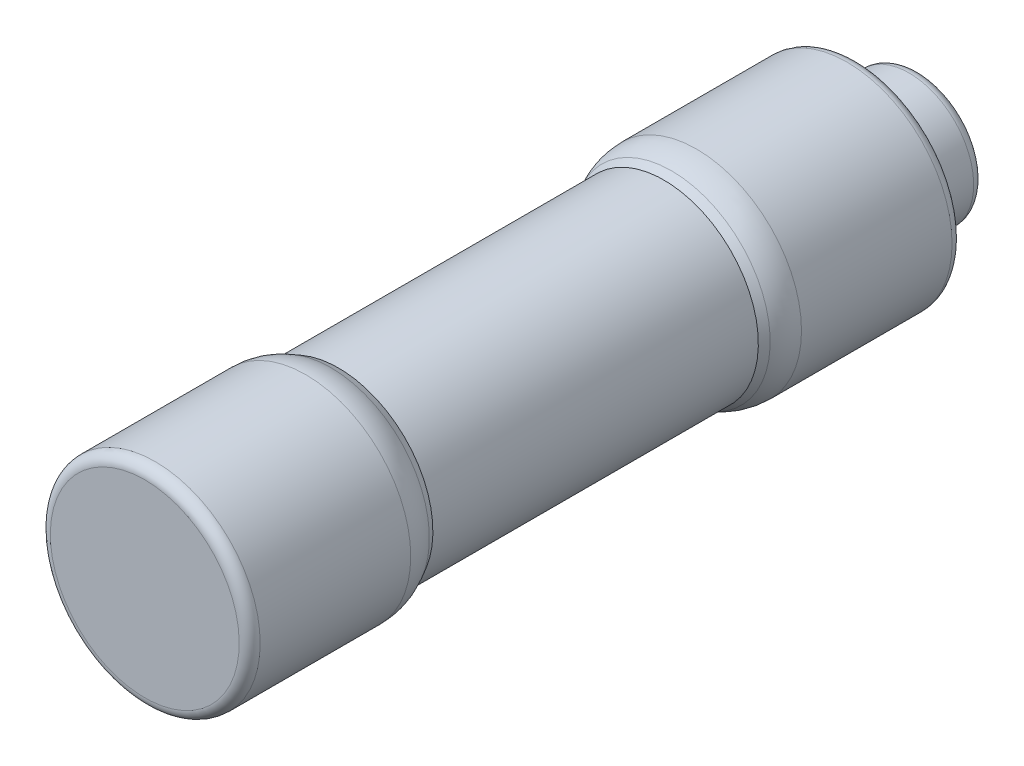
ISO-10303-21;
HEADER;
FILE_DESCRIPTION(('STEP AP214'),'2;1');
FILE_NAME('part.step','',(''),(''),'','','');
FILE_SCHEMA(('AUTOMOTIVE_DESIGN { 1 0 10303 214 1 1 1 1 }'));
ENDSEC;
DATA;
#1=APPLICATION_CONTEXT('core data for automotive mechanical design processes');
#2=APPLICATION_PROTOCOL_DEFINITION('international standard','automotive_design',2000,#1);
#3=PRODUCT_CONTEXT('',#1,'mechanical');
#4=PRODUCT('Part','Part','',(#3));
#5=PRODUCT_RELATED_PRODUCT_CATEGORY('part','',(#4));
#6=PRODUCT_DEFINITION_FORMATION('','',#4);
#7=PRODUCT_DEFINITION_CONTEXT('part definition',#1,'design');
#8=PRODUCT_DEFINITION('design','',#6,#7);
#9=PRODUCT_DEFINITION_SHAPE('','',#8);
#10=(LENGTH_UNIT() NAMED_UNIT(*) SI_UNIT(.MILLI.,.METRE.));
#11=(NAMED_UNIT(*) PLANE_ANGLE_UNIT() SI_UNIT($,.RADIAN.));
#12=(NAMED_UNIT(*) SI_UNIT($,.STERADIAN.) SOLID_ANGLE_UNIT());
#13=UNCERTAINTY_MEASURE_WITH_UNIT(LENGTH_MEASURE(1.E-05),#10,'distance_accuracy_value','');
#14=(GEOMETRIC_REPRESENTATION_CONTEXT(3) GLOBAL_UNCERTAINTY_ASSIGNED_CONTEXT((#13)) GLOBAL_UNIT_ASSIGNED_CONTEXT((#10,
#11,#12)) REPRESENTATION_CONTEXT('',''));
#15=CARTESIAN_POINT('',(0.,0.,0.));
#16=DIRECTION('',(0.,0.,1.));
#17=DIRECTION('',(1.,0.,0.));
#18=AXIS2_PLACEMENT_3D('',#15,#16,#17);
#19=CARTESIAN_POINT('',(-5.169375,-4.64343749999999,-6.477));
#20=DIRECTION('',(0.,0.,-1.));
#21=DIRECTION('',(0.,1.,0.));
#22=AXIS2_PLACEMENT_3D('',#19,#20,#21);
#23=PLANE('',#22);
#24=CARTESIAN_POINT('',(0.,0.,-6.477));
#25=DIRECTION('',(0.,0.,1.));
#26=DIRECTION('',(0.,-1.,0.));
#27=AXIS2_PLACEMENT_3D('',#24,#25,#26);
#28=CIRCLE('',#27,4.6434375);
#29=CARTESIAN_POINT('',(0.,-4.64343749999999,-6.477));
#30=VERTEX_POINT('',#29);
#31=EDGE_CURVE('E11',#30,#30,#28,.T.);
#32=ORIENTED_EDGE('',*,*,#31,.F.);
#33=EDGE_LOOP('',(#32));
#34=FACE_BOUND('',#33,.T.);
#35=ADVANCED_FACE('F39',(#34),#23,.T.);
#36=CARTESIAN_POINT('',(-5.169375,-4.64343749999999,9.525));
#37=DIRECTION('',(0.,0.,1.));
#38=DIRECTION('',(1.,0.,0.));
#39=AXIS2_PLACEMENT_3D('',#36,#37,#38);
#40=PLANE('',#39);
#41=CARTESIAN_POINT('',(0.,0.,9.525));
#42=DIRECTION('',(0.,0.,1.));
#43=DIRECTION('',(0.,-1.,0.));
#44=AXIS2_PLACEMENT_3D('',#41,#42,#43);
#45=CIRCLE('',#44,4.6434375);
#46=CARTESIAN_POINT('',(0.,-4.64343749999999,9.525));
#47=VERTEX_POINT('',#46);
#48=EDGE_CURVE('E45',#47,#47,#45,.T.);
#49=ORIENTED_EDGE('',*,*,#48,.T.);
#50=EDGE_LOOP('',(#49));
#51=FACE_BOUND('',#50,.T.);
#52=ADVANCED_FACE('F51',(#51),#40,.T.);
#53=CARTESIAN_POINT('',(0.,0.,19.05));
#54=DIRECTION('',(0.,0.,1.));
#55=DIRECTION('',(0.,-1.,0.));
#56=AXIS2_PLACEMENT_3D('',#53,#54,#55);
#57=CYLINDRICAL_SURFACE('',#56,4.6434375);
#58=ORIENTED_EDGE('',*,*,#48,.F.);
#59=EDGE_LOOP('',(#58));
#60=FACE_BOUND('',#59,.T.);
#61=ORIENTED_EDGE('',*,*,#31,.T.);
#62=EDGE_LOOP('',(#61));
#63=FACE_BOUND('',#62,.T.);
#64=ADVANCED_FACE('F53',(#60,#63),#57,.T.);
#65=CLOSED_SHELL('',(#35,#52,#64));
#66=MANIFOLD_SOLID_BREP('B2',#65);
#67=CARTESIAN_POINT('',(-5.169375,-4.64343749999999,-6.477));
#68=DIRECTION('',(0.,0.,-1.));
#69=DIRECTION('',(0.,1.,0.));
#70=AXIS2_PLACEMENT_3D('',#67,#68,#69);
#71=PLANE('',#70);
#72=CARTESIAN_POINT('',(0.,0.,-6.477));
#73=DIRECTION('',(0.,0.,1.));
#74=DIRECTION('',(0.,-1.,0.));
#75=AXIS2_PLACEMENT_3D('',#72,#73,#74);
#76=CIRCLE('',#75,4.6434375);
#77=CARTESIAN_POINT('',(0.,-4.64343749999999,-6.477));
#78=VERTEX_POINT('',#77);
#79=EDGE_CURVE('E90',#78,#78,#76,.T.);
#80=ORIENTED_EDGE('',*,*,#79,.T.);
#81=EDGE_LOOP('',(#80));
#82=FACE_BOUND('',#81,.T.);
#83=ADVANCED_FACE('F86',(#82),#71,.F.);
#84=CARTESIAN_POINT('',(0.,0.,-19.05));
#85=DIRECTION('',(0.,0.,1.));
#86=DIRECTION('',(0.,-1.,0.));
#87=AXIS2_PLACEMENT_3D('',#84,#85,#86);
#88=PLANE('',#87);
#89=CARTESIAN_POINT('',(0.,0.,-19.05));
#90=DIRECTION('',(0.,0.,1.));
#91=DIRECTION('',(0.,-1.,0.));
#92=AXIS2_PLACEMENT_3D('',#89,#90,#91);
#93=CIRCLE('',#92,2.65906249999999);
#94=CARTESIAN_POINT('',(0.,-2.65906249999999,-19.05));
#95=VERTEX_POINT('',#94);
#96=EDGE_CURVE('E106',#95,#95,#93,.F.);
#97=ORIENTED_EDGE('',*,*,#96,.T.);
#98=EDGE_LOOP('',(#97));
#99=FACE_BOUND('',#98,.T.);
#100=ADVANCED_FACE('F135',(#99),#88,.F.);
#101=CARTESIAN_POINT('',(0.,0.,19.05));
#102=DIRECTION('',(0.,0.,1.));
#103=DIRECTION('',(0.,-1.,0.));
#104=AXIS2_PLACEMENT_3D('',#101,#102,#103);
#105=CYLINDRICAL_SURFACE('',#104,3.17499999999999);
#106=CARTESIAN_POINT('',(0.,0.,-18.5340625));
#107=DIRECTION('',(0.,0.,1.));
#108=DIRECTION('',(0.,-1.,0.));
#109=AXIS2_PLACEMENT_3D('',#106,#107,#108);
#110=CIRCLE('',#109,3.17499999999999);
#111=CARTESIAN_POINT('',(0.,-3.17499999999999,-18.5340625));
#112=VERTEX_POINT('',#111);
#113=EDGE_CURVE('E103',#112,#112,#110,.T.);
#114=ORIENTED_EDGE('',*,*,#113,.T.);
#115=EDGE_LOOP('',(#114));
#116=FACE_BOUND('',#115,.T.);
#117=CARTESIAN_POINT('',(0.,0.,-16.5179375));
#118=DIRECTION('',(0.,0.,1.));
#119=DIRECTION('',(0.,-1.,0.));
#120=AXIS2_PLACEMENT_3D('',#117,#118,#119);
#121=CIRCLE('',#120,3.17499999999999);
#122=CARTESIAN_POINT('',(0.,-3.17499999999999,-16.5179375));
#123=VERTEX_POINT('',#122);
#124=EDGE_CURVE('E98',#123,#123,#121,.F.);
#125=ORIENTED_EDGE('',*,*,#124,.T.);
#126=EDGE_LOOP('',(#125));
#127=FACE_BOUND('',#126,.T.);
#128=ADVANCED_FACE('F141',(#116,#127),#105,.T.);
#129=CARTESIAN_POINT('',(0.,3.175,-16.002));
#130=DIRECTION('',(0.,0.,1.));
#131=DIRECTION('',(0.,-1.,0.));
#132=AXIS2_PLACEMENT_3D('',#129,#130,#131);
#133=PLANE('',#132);
#134=CARTESIAN_POINT('',(0.,0.,-16.002));
#135=DIRECTION('',(0.,0.,1.));
#136=DIRECTION('',(0.,-1.,0.));
#137=AXIS2_PLACEMENT_3D('',#134,#135,#136);
#138=CIRCLE('',#137,3.69093749999999);
#139=CARTESIAN_POINT('',(0.,-3.69093749999999,-16.002));
#140=VERTEX_POINT('',#139);
#141=EDGE_CURVE('E112',#140,#140,#138,.T.);
#142=ORIENTED_EDGE('',*,*,#141,.T.);
#143=EDGE_LOOP('',(#142));
#144=FACE_BOUND('',#143,.T.);
#145=CARTESIAN_POINT('',(0.,0.,-16.002));
#146=DIRECTION('',(0.,0.,1.));
#147=DIRECTION('',(0.,-1.,0.));
#148=AXIS2_PLACEMENT_3D('',#145,#146,#147);
#149=CIRCLE('',#148,4.6434375);
#150=CARTESIAN_POINT('',(0.,-4.64343749999999,-16.002));
#151=VERTEX_POINT('',#150);
#152=EDGE_CURVE('E109',#151,#151,#149,.F.);
#153=ORIENTED_EDGE('',*,*,#152,.T.);
#154=EDGE_LOOP('',(#153));
#155=FACE_BOUND('',#154,.T.);
#156=ADVANCED_FACE('F133',(#144,#155),#133,.F.);
#157=CARTESIAN_POINT('',(0.,0.,19.05));
#158=DIRECTION('',(0.,0.,1.));
#159=DIRECTION('',(0.,-1.,0.));
#160=AXIS2_PLACEMENT_3D('',#157,#158,#159);
#161=CYLINDRICAL_SURFACE('',#160,5.159375);
#162=CARTESIAN_POINT('',(0.,0.,-15.4860625));
#163=DIRECTION('',(0.,0.,1.));
#164=DIRECTION('',(0.,-1.,0.));
#165=AXIS2_PLACEMENT_3D('',#162,#163,#164);
#166=CIRCLE('',#165,5.159375);
#167=CARTESIAN_POINT('',(0.,-5.15937499999999,-15.4860625));
#168=VERTEX_POINT('',#167);
#169=EDGE_CURVE('E115',#168,#168,#166,.T.);
#170=ORIENTED_EDGE('',*,*,#169,.T.);
#171=EDGE_LOOP('',(#170));
#172=FACE_BOUND('',#171,.T.);
#173=CARTESIAN_POINT('',(0.,0.,-8.08328967538261));
#174=DIRECTION('',(0.,0.,-1.));
#175=DIRECTION('',(0.,1.,0.));
#176=AXIS2_PLACEMENT_3D('',#173,#174,#175);
#177=CIRCLE('',#176,5.159375);
#178=CARTESIAN_POINT('',(0.,5.159375,-8.08328967538261));
#179=VERTEX_POINT('',#178);
#180=EDGE_CURVE('E94',#179,#179,#177,.T.);
#181=ORIENTED_EDGE('',*,*,#180,.T.);
#182=EDGE_LOOP('',(#181));
#183=FACE_BOUND('',#182,.T.);
#184=ADVANCED_FACE('F125',(#172,#183),#161,.T.);
#185=CARTESIAN_POINT('',(0.,0.,-7.4295));
#186=DIRECTION('',(0.,0.,-1.));
#187=DIRECTION('',(0.,1.,0.));
#188=AXIS2_PLACEMENT_3D('',#185,#186,#187);
#189=CONICAL_SURFACE('',#188,5.159375,0.496422753404885);
#190=CARTESIAN_POINT('',(0.,0.,-6.85462799063139));
#191=DIRECTION('',(0.,0.,1.));
#192=DIRECTION('',(0.,-1.,0.));
#193=AXIS2_PLACEMENT_3D('',#190,#191,#192);
#194=CIRCLE('',#193,4.84798599492533);
#195=CARTESIAN_POINT('',(0.,-4.84798599492532,-6.85462799063139));
#196=VERTEX_POINT('',#195);
#197=EDGE_CURVE('E38',#196,#196,#194,.T.);
#198=ORIENTED_EDGE('',*,*,#197,.T.);
#199=EDGE_LOOP('',(#198));
#200=FACE_BOUND('',#199,.T.);
#201=ORIENTED_EDGE('',*,*,#79,.F.);
#202=EDGE_LOOP('',(#201));
#203=FACE_BOUND('',#202,.T.);
#204=ADVANCED_FACE('F88',(#200,#203),#189,.T.);
#205=CARTESIAN_POINT('',(0.,0.,-8.08328967538261));
#206=DIRECTION('',(0.,0.,-1.));
#207=DIRECTION('',(0.,1.,0.));
#208=AXIS2_PLACEMENT_3D('',#205,#206,#207);
#209=DEGENERATE_TOROIDAL_SURFACE('',#208,2.5796875,2.5796875,.T.);
#210=ORIENTED_EDGE('',*,*,#180,.F.);
#211=EDGE_LOOP('',(#210));
#212=FACE_BOUND('',#211,.T.);
#213=ORIENTED_EDGE('',*,*,#197,.F.);
#214=EDGE_LOOP('',(#213));
#215=FACE_BOUND('',#214,.T.);
#216=ADVANCED_FACE('F124',(#212,#215),#209,.T.);
#217=CARTESIAN_POINT('',(0.,0.,-18.5340625));
#218=DIRECTION('',(0.,0.,1.));
#219=DIRECTION('',(0.,-1.,0.));
#220=AXIS2_PLACEMENT_3D('',#217,#218,#219);
#221=TOROIDAL_SURFACE('',#220,2.65906249999999,0.5159375);
#222=ORIENTED_EDGE('',*,*,#96,.F.);
#223=EDGE_LOOP('',(#222));
#224=FACE_BOUND('',#223,.T.);
#225=ORIENTED_EDGE('',*,*,#113,.F.);
#226=EDGE_LOOP('',(#225));
#227=FACE_BOUND('',#226,.T.);
#228=ADVANCED_FACE('F130',(#224,#227),#221,.T.);
#229=CARTESIAN_POINT('',(0.,0.,-16.5179375));
#230=DIRECTION('',(0.,0.,1.));
#231=DIRECTION('',(0.,-1.,0.));
#232=AXIS2_PLACEMENT_3D('',#229,#230,#231);
#233=TOROIDAL_SURFACE('',#232,3.69093749999999,0.5159375);
#234=ORIENTED_EDGE('',*,*,#124,.F.);
#235=EDGE_LOOP('',(#234));
#236=FACE_BOUND('',#235,.T.);
#237=ORIENTED_EDGE('',*,*,#141,.F.);
#238=EDGE_LOOP('',(#237));
#239=FACE_BOUND('',#238,.T.);
#240=ADVANCED_FACE('F146',(#236,#239),#233,.F.);
#241=CARTESIAN_POINT('',(0.,0.,-15.4860625));
#242=DIRECTION('',(0.,0.,1.));
#243=DIRECTION('',(0.,-1.,0.));
#244=AXIS2_PLACEMENT_3D('',#241,#242,#243);
#245=TOROIDAL_SURFACE('',#244,4.6434375,0.5159375);
#246=ORIENTED_EDGE('',*,*,#152,.F.);
#247=EDGE_LOOP('',(#246));
#248=FACE_BOUND('',#247,.T.);
#249=ORIENTED_EDGE('',*,*,#169,.F.);
#250=EDGE_LOOP('',(#249));
#251=FACE_BOUND('',#250,.T.);
#252=ADVANCED_FACE('F137',(#248,#251),#245,.T.);
#253=CLOSED_SHELL('',(#83,#100,#128,#156,#184,#204,#216,#228,#240,#252));
#254=MANIFOLD_SOLID_BREP('B6',#253);
#255=CARTESIAN_POINT('',(-5.169375,-4.64343749999999,9.525));
#256=DIRECTION('',(0.,0.,1.));
#257=DIRECTION('',(1.,0.,0.));
#258=AXIS2_PLACEMENT_3D('',#255,#256,#257);
#259=PLANE('',#258);
#260=CARTESIAN_POINT('',(0.,0.,9.525));
#261=DIRECTION('',(0.,0.,1.));
#262=DIRECTION('',(0.,-1.,0.));
#263=AXIS2_PLACEMENT_3D('',#260,#261,#262);
#264=CIRCLE('',#263,4.6434375);
#265=CARTESIAN_POINT('',(0.,-4.64343749999999,9.525));
#266=VERTEX_POINT('',#265);
#267=EDGE_CURVE('E250',#266,#266,#264,.T.);
#268=ORIENTED_EDGE('',*,*,#267,.F.);
#269=EDGE_LOOP('',(#268));
#270=FACE_BOUND('',#269,.T.);
#271=ADVANCED_FACE('F231',(#270),#259,.F.);
#272=CARTESIAN_POINT('',(0.,5.159375,19.05));
#273=DIRECTION('',(0.,0.,-1.));
#274=DIRECTION('',(0.,1.,0.));
#275=AXIS2_PLACEMENT_3D('',#272,#273,#274);
#276=PLANE('',#275);
#277=CARTESIAN_POINT('',(0.,0.,19.05));
#278=DIRECTION('',(0.,0.,-1.));
#279=DIRECTION('',(0.,1.,0.));
#280=AXIS2_PLACEMENT_3D('',#277,#278,#279);
#281=CIRCLE('',#280,4.6434375);
#282=CARTESIAN_POINT('',(0.,4.6434375,19.05));
#283=VERTEX_POINT('',#282);
#284=EDGE_CURVE('E237',#283,#283,#281,.F.);
#285=ORIENTED_EDGE('',*,*,#284,.T.);
#286=EDGE_LOOP('',(#285));
#287=FACE_BOUND('',#286,.T.);
#288=ADVANCED_FACE('F257',(#287),#276,.F.);
#289=CARTESIAN_POINT('',(0.,0.,18.5340625));
#290=DIRECTION('',(0.,0.,-1.));
#291=DIRECTION('',(0.,1.,0.));
#292=AXIS2_PLACEMENT_3D('',#289,#290,#291);
#293=TOROIDAL_SURFACE('',#292,4.6434375,0.5159375);
#294=CARTESIAN_POINT('',(0.,0.,18.5340625));
#295=DIRECTION('',(0.,0.,-1.));
#296=DIRECTION('',(0.,1.,0.));
#297=AXIS2_PLACEMENT_3D('',#294,#295,#296);
#298=CIRCLE('',#297,5.159375);
#299=CARTESIAN_POINT('',(0.,5.159375,18.5340625));
#300=VERTEX_POINT('',#299);
#301=EDGE_CURVE('E85',#300,#300,#298,.T.);
#302=ORIENTED_EDGE('',*,*,#301,.F.);
#303=EDGE_LOOP('',(#302));
#304=FACE_BOUND('',#303,.T.);
#305=ORIENTED_EDGE('',*,*,#284,.F.);
#306=EDGE_LOOP('',(#305));
#307=FACE_BOUND('',#306,.T.);
#308=ADVANCED_FACE('F261',(#304,#307),#293,.T.);
#309=CARTESIAN_POINT('',(0.,0.,19.05));
#310=DIRECTION('',(0.,0.,1.));
#311=DIRECTION('',(0.,-1.,0.));
#312=AXIS2_PLACEMENT_3D('',#309,#310,#311);
#313=CYLINDRICAL_SURFACE('',#312,5.159375);
#314=ORIENTED_EDGE('',*,*,#301,.T.);
#315=EDGE_LOOP('',(#314));
#316=FACE_BOUND('',#315,.T.);
#317=CARTESIAN_POINT('',(0.,0.,11.1312896753826));
#318=DIRECTION('',(0.,0.,-1.));
#319=DIRECTION('',(0.,1.,0.));
#320=AXIS2_PLACEMENT_3D('',#317,#318,#319);
#321=CIRCLE('',#320,5.159375);
#322=CARTESIAN_POINT('',(0.,5.159375,11.1312896753826));
#323=VERTEX_POINT('',#322);
#324=EDGE_CURVE('E245',#323,#323,#321,.F.);
#325=ORIENTED_EDGE('',*,*,#324,.T.);
#326=EDGE_LOOP('',(#325));
#327=FACE_BOUND('',#326,.T.);
#328=ADVANCED_FACE('F270',(#316,#327),#313,.T.);
#329=CARTESIAN_POINT('',(0.,0.,11.1312896753826));
#330=DIRECTION('',(0.,0.,-1.));
#331=DIRECTION('',(0.,1.,0.));
#332=AXIS2_PLACEMENT_3D('',#329,#330,#331);
#333=DEGENERATE_TOROIDAL_SURFACE('',#332,2.5796875,2.5796875,.T.);
#334=CARTESIAN_POINT('',(0.,0.,9.90262799063138));
#335=DIRECTION('',(0.,0.,-1.));
#336=DIRECTION('',(0.,1.,0.));
#337=AXIS2_PLACEMENT_3D('',#334,#335,#336);
#338=CIRCLE('',#337,4.84798599492533);
#339=CARTESIAN_POINT('',(0.,4.84798599492533,9.90262799063139));
#340=VERTEX_POINT('',#339);
#341=EDGE_CURVE('E241',#340,#340,#338,.T.);
#342=ORIENTED_EDGE('',*,*,#341,.F.);
#343=EDGE_LOOP('',(#342));
#344=FACE_BOUND('',#343,.T.);
#345=ORIENTED_EDGE('',*,*,#324,.F.);
#346=EDGE_LOOP('',(#345));
#347=FACE_BOUND('',#346,.T.);
#348=ADVANCED_FACE('F264',(#344,#347),#333,.T.);
#349=CARTESIAN_POINT('',(0.,0.,9.525));
#350=DIRECTION('',(0.,0.,1.));
#351=DIRECTION('',(0.,-1.,0.));
#352=AXIS2_PLACEMENT_3D('',#349,#350,#351);
#353=CONICAL_SURFACE('',#352,4.6434375,0.496422753404885);
#354=ORIENTED_EDGE('',*,*,#341,.T.);
#355=EDGE_LOOP('',(#354));
#356=FACE_BOUND('',#355,.T.);
#357=ORIENTED_EDGE('',*,*,#267,.T.);
#358=EDGE_LOOP('',(#357));
#359=FACE_BOUND('',#358,.T.);
#360=ADVANCED_FACE('F254',(#356,#359),#353,.T.);
#361=CLOSED_SHELL('',(#271,#288,#308,#328,#348,#360));
#362=MANIFOLD_SOLID_BREP('B33',#361);
#363=ADVANCED_BREP_SHAPE_REPRESENTATION('',(#18,#66,#254,#362),#14);
#364=SHAPE_DEFINITION_REPRESENTATION(#9,#363);
ENDSEC;
END-ISO-10303-21;
